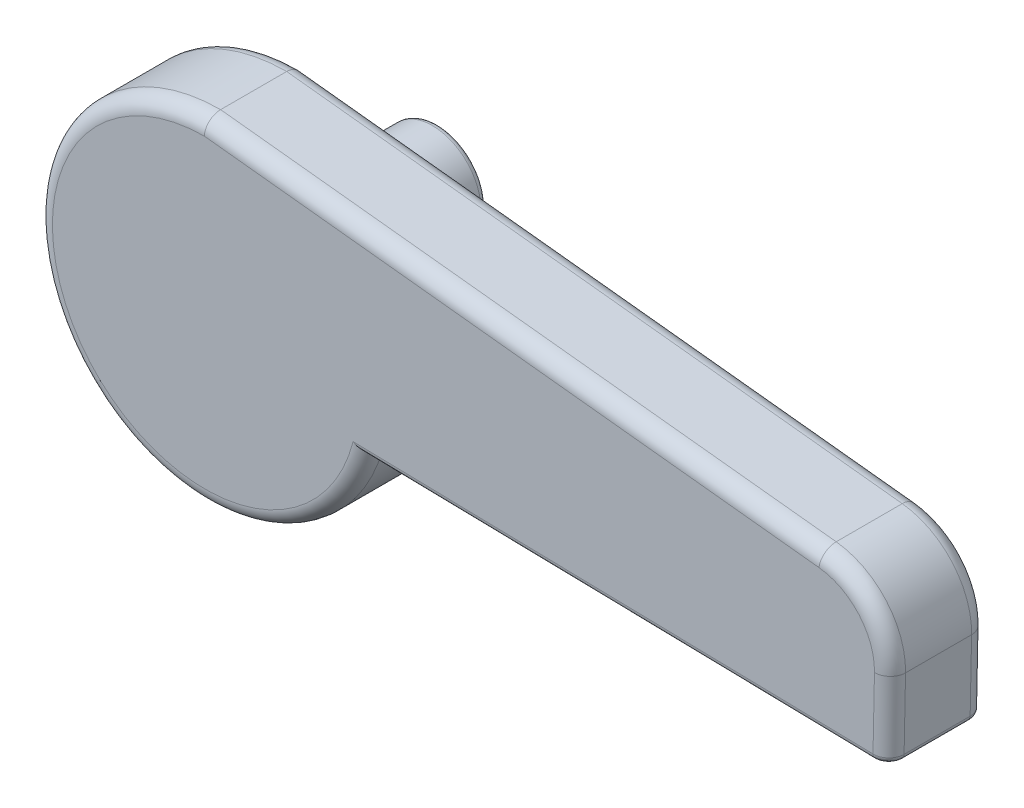
ISO-10303-21;
HEADER;
FILE_DESCRIPTION(('STEP AP214'),'2;1');
FILE_NAME('part.step','',(''),(''),'','','');
FILE_SCHEMA(('AUTOMOTIVE_DESIGN { 1 0 10303 214 1 1 1 1 }'));
ENDSEC;
DATA;
#1=APPLICATION_CONTEXT('core data for automotive mechanical design processes');
#2=APPLICATION_PROTOCOL_DEFINITION('international standard','automotive_design',2000,#1);
#3=PRODUCT_CONTEXT('',#1,'mechanical');
#4=PRODUCT('Part','Part','',(#3));
#5=PRODUCT_RELATED_PRODUCT_CATEGORY('part','',(#4));
#6=PRODUCT_DEFINITION_FORMATION('','',#4);
#7=PRODUCT_DEFINITION_CONTEXT('part definition',#1,'design');
#8=PRODUCT_DEFINITION('design','',#6,#7);
#9=PRODUCT_DEFINITION_SHAPE('','',#8);
#10=(LENGTH_UNIT() NAMED_UNIT(*) SI_UNIT(.MILLI.,.METRE.));
#11=(NAMED_UNIT(*) PLANE_ANGLE_UNIT() SI_UNIT($,.RADIAN.));
#12=(NAMED_UNIT(*) SI_UNIT($,.STERADIAN.) SOLID_ANGLE_UNIT());
#13=UNCERTAINTY_MEASURE_WITH_UNIT(LENGTH_MEASURE(1.E-05),#10,'distance_accuracy_value','');
#14=(GEOMETRIC_REPRESENTATION_CONTEXT(3) GLOBAL_UNCERTAINTY_ASSIGNED_CONTEXT((#13)) GLOBAL_UNIT_ASSIGNED_CONTEXT((#10,
#11,#12)) REPRESENTATION_CONTEXT('',''));
#15=CARTESIAN_POINT('',(0.,0.,0.));
#16=DIRECTION('',(0.,0.,1.));
#17=DIRECTION('',(1.,0.,0.));
#18=AXIS2_PLACEMENT_3D('',#15,#16,#17);
#19=CARTESIAN_POINT('',(48.1945710192057,-2.50000000000015,5.49999999999978));
#20=DIRECTION('',(0.,0.,-1.));
#21=DIRECTION('',(-1.,0.,0.));
#22=AXIS2_PLACEMENT_3D('',#19,#20,#21);
#23=CYLINDRICAL_SURFACE('',#22,2.5);
#24=CARTESIAN_POINT('',(48.1945710192057,-2.50000000000015,-4.20000000000022));
#25=DIRECTION('',(0.,0.,1.));
#26=DIRECTION('',(1.,0.,0.));
#27=AXIS2_PLACEMENT_3D('',#24,#25,#26);
#28=CIRCLE('',#27,2.5);
#29=CARTESIAN_POINT('',(50.6945710192057,-2.50000000000015,-4.20000000000022));
#30=VERTEX_POINT('',#29);
#31=EDGE_CURVE('E380',#30,#30,#28,.T.);
#32=ORIENTED_EDGE('',*,*,#31,.T.);
#33=EDGE_LOOP('',(#32));
#34=FACE_BOUND('',#33,.T.);
#35=CARTESIAN_POINT('',(48.1945710192057,-2.50000000000015,1.49999999999978));
#36=DIRECTION('',(0.,0.,1.));
#37=DIRECTION('',(1.,0.,0.));
#38=AXIS2_PLACEMENT_3D('',#35,#36,#37);
#39=CIRCLE('',#38,2.5);
#40=CARTESIAN_POINT('',(50.6945710192057,-2.50000000000015,1.49999999999978));
#41=VERTEX_POINT('',#40);
#42=EDGE_CURVE('E382',#41,#41,#39,.F.);
#43=ORIENTED_EDGE('',*,*,#42,.T.);
#44=EDGE_LOOP('',(#43));
#45=FACE_BOUND('',#44,.T.);
#46=ADVANCED_FACE('F41',(#34,#45),#23,.T.);
#47=CARTESIAN_POINT('',(48.1945710192057,-2.50000000000015,-4.50000000000022));
#48=DIRECTION('',(0.,0.,1.));
#49=DIRECTION('',(1.,0.,0.));
#50=AXIS2_PLACEMENT_3D('',#47,#48,#49);
#51=PLANE('',#50);
#52=CARTESIAN_POINT('',(48.1945710192057,-2.50000000000015,-4.50000000000022));
#53=DIRECTION('',(0.,0.,1.));
#54=DIRECTION('',(1.,0.,0.));
#55=AXIS2_PLACEMENT_3D('',#52,#53,#54);
#56=CIRCLE('',#55,2.2);
#57=CARTESIAN_POINT('',(50.3945710192057,-2.50000000000015,-4.50000000000022));
#58=VERTEX_POINT('',#57);
#59=EDGE_CURVE('E149',#58,#58,#56,.F.);
#60=ORIENTED_EDGE('',*,*,#59,.T.);
#61=EDGE_LOOP('',(#60));
#62=FACE_BOUND('',#61,.T.);
#63=ADVANCED_FACE('F205',(#62),#51,.F.);
#64=CARTESIAN_POINT('',(-0.073121969890185,-3.59102972612676,7.49999999999978));
#65=DIRECTION('',(-0.0203581760665292,-0.999792750857519,0.));
#66=DIRECTION('',(0.999792750857519,-0.0203581760665292,0.));
#67=AXIS2_PLACEMENT_3D('',#64,#65,#66);
#68=PLANE('',#67);
#69=CARTESIAN_POINT('',(77.1202218189666,-5.16287117293639,5.00064844914062));
#70=DIRECTION('',(-0.0203581760665292,-0.999792750857519,0.));
#71=DIRECTION('',(0.999792750857519,-0.0203581760665292,0.));
#72=AXIS2_PLACEMENT_3D('',#69,#70,#71);
#73=CIRCLE('',#72,1.74999999999999);
#74=CARTESIAN_POINT('',(78.8698591329672,-5.19849798105282,5.00064844914062));
#75=VERTEX_POINT('',#74);
#76=EDGE_CURVE('E393',#75,#75,#73,.T.);
#77=ORIENTED_EDGE('',*,*,#76,.F.);
#78=EDGE_LOOP('',(#77));
#79=FACE_BOUND('',#78,.T.);
#80=CARTESIAN_POINT('',(62.1233316379012,-4.85749855396644,5.00634587382254));
#81=DIRECTION('',(-0.0203581760665292,-0.999792750857519,0.));
#82=DIRECTION('',(0.999792750857519,-0.0203581760665292,0.));
#83=AXIS2_PLACEMENT_3D('',#80,#81,#82);
#84=CIRCLE('',#83,1.74999999999999);
#85=CARTESIAN_POINT('',(63.8729689519018,-4.89312536208287,5.00634587382254));
#86=VERTEX_POINT('',#85);
#87=EDGE_CURVE('E390',#86,#86,#84,.T.);
#88=ORIENTED_EDGE('',*,*,#87,.F.);
#89=EDGE_LOOP('',(#88));
#90=FACE_BOUND('',#89,.T.);
#91=CARTESIAN_POINT('',(82.5687320547102,-5.27381589681483,6.69999999999978));
#92=DIRECTION('',(-0.0203581760665292,-0.999792750857519,0.));
#93=DIRECTION('',(0.999792750857519,-0.0203581760665292,0.));
#94=AXIS2_PLACEMENT_3D('',#91,#92,#93);
#95=CIRCLE('',#94,0.5);
#96=CARTESIAN_POINT('',(83.068628430139,-5.2839949848481,6.69999999999978));
#97=VERTEX_POINT('',#96);
#98=CARTESIAN_POINT('',(82.5687320547102,-5.27381589681483,7.19999999999978));
#99=VERTEX_POINT('',#98);
#100=EDGE_CURVE('E348',#97,#99,#95,.T.);
#101=ORIENTED_EDGE('',*,*,#100,.T.);
#102=DIRECTION('',(-0.999792750857519,0.0203581760665292,0.));
#103=VECTOR('',#102,1.);
#104=CARTESIAN_POINT('',(-0.073121969890185,-3.59102972612676,7.19999999999978));
#105=LINE('',#104,#103);
#106=CARTESIAN_POINT('',(56.3767467829092,-4.74048431660691,7.19999999999979));
#107=VERTEX_POINT('',#106);
#108=EDGE_CURVE('E350',#99,#107,#105,.T.);
#109=ORIENTED_EDGE('',*,*,#108,.T.);
#110=CARTESIAN_POINT('',(55.7312139879501,-4.72733972210448,7.49999999999978));
#111=CARTESIAN_POINT('',(55.7789212996699,-4.72831115728524,7.50003397064687));
#112=CARTESIAN_POINT('',(55.8266315718824,-4.72928265274872,7.49602955410145));
#113=CARTESIAN_POINT('',(55.9207422157983,-4.73119897096261,7.48014592752088));
#114=CARTESIAN_POINT('',(55.967142061802,-4.73214378300849,7.46826360263125));
#115=CARTESIAN_POINT('',(56.0573204224829,-4.73398003051335,7.43681100258886));
#116=CARTESIAN_POINT('',(56.1010963185076,-4.73487141265027,7.41723319000377));
#117=CARTESIAN_POINT('',(56.1846284621169,-4.73657232725018,7.37086998223443));
#118=CARTESIAN_POINT('',(56.2243868812021,-4.73738190393011,7.34408850970474));
#119=CARTESIAN_POINT('',(56.2979017520504,-4.73887884285366,7.28459841150574));
#120=CARTESIAN_POINT('',(56.3317611647186,-4.73956830162801,7.25201718374874));
#121=CARTESIAN_POINT('',(56.3933221880693,-4.74082183157322,7.18145649790667));
#122=CARTESIAN_POINT('',(56.4210229828188,-4.74138588612974,7.14347632562639));
#123=CARTESIAN_POINT('',(56.468548959889,-4.74235362890253,7.06449131041161));
#124=CARTESIAN_POINT('',(56.4885933147328,-4.74276177999654,7.02361817616138));
#125=CARTESIAN_POINT('',(56.5213149064872,-4.74342807001069,6.93904121656419));
#126=CARTESIAN_POINT('',(56.5339997550354,-4.743686363922,6.89534036800726));
#127=CARTESIAN_POINT('',(56.5477104187668,-4.74396554588846,6.82605275719267));
#128=CARTESIAN_POINT('',(56.5514106755768,-4.7440408919835,6.80096682670318));
#129=CARTESIAN_POINT('',(56.5563454941828,-4.74414137671491,6.7505913979176));
#130=CARTESIAN_POINT('',(56.5575837291154,-4.74416659014515,6.72530225947758));
#131=CARTESIAN_POINT('',(56.5575822859618,-4.74416656075908,6.69999999999975));
#132=B_SPLINE_CURVE_WITH_KNOTS('',3,(#110,#111,#112,#113,#114,#115,#116,#117,#118,#119,#120,
#121,#122,#123,#124,#125,#126,#127,#128,#129,#130,#131),.UNSPECIFIED.,.F.,.F.,(4,2,2,2,2,2,2,2,
2,2,4),(0.,0.142990058816161,0.286036688366128,0.429223777081963,0.572333052522775,
0.712618169705682,0.852921861696044,0.988838524067434,1.12461436162129,1.20057852384013,
1.27642926840867),.UNSPECIFIED.);
#133=CARTESIAN_POINT('',(56.5575822859622,-4.74416656075865,6.69999999999978));
#134=VERTEX_POINT('',#133);
#135=EDGE_CURVE('E211',#107,#134,#132,.T.);
#136=ORIENTED_EDGE('',*,*,#135,.T.);
#137=DIRECTION('',(0.,0.,-1.));
#138=VECTOR('',#137,1.);
#139=CARTESIAN_POINT('',(56.5575822859622,-4.74416656075865,7.49999999999978));
#140=LINE('',#139,#138);
#141=CARTESIAN_POINT('',(56.5575822859622,-4.74416656075865,3.29999999999978));
#142=VERTEX_POINT('',#141);
#143=EDGE_CURVE('E367',#134,#142,#140,.T.);
#144=ORIENTED_EDGE('',*,*,#143,.T.);
#145=CARTESIAN_POINT('',(56.5575822859619,-4.74416656075858,3.29999999999978));
#146=CARTESIAN_POINT('',(56.557625403597,-4.74416743873727,3.25596612702113));
#147=CARTESIAN_POINT('',(56.5538413345335,-4.74409038602405,3.21195070675883));
#148=CARTESIAN_POINT('',(56.5389453240458,-4.74378706755746,3.12524602035933));
#149=CARTESIAN_POINT('',(56.5278447936871,-4.74356103416072,3.08255479733669));
#150=CARTESIAN_POINT('',(56.4986373213318,-4.74296630003789,2.99963404953817));
#151=CARTESIAN_POINT('',(56.4805288448736,-4.74259756806648,2.95940506613069));
#152=CARTESIAN_POINT('',(56.4378963109812,-4.74172946752225,2.88251062235352));
#153=CARTESIAN_POINT('',(56.4133720109644,-4.74123009400987,2.84584529679786));
#154=CARTESIAN_POINT('',(56.3583318718413,-4.74010934489258,2.77662312331813));
#155=CARTESIAN_POINT('',(56.3277488506898,-4.73948660130025,2.74411976576125));
#156=CARTESIAN_POINT('',(56.261689139985,-4.73814146730095,2.68453792132652));
#157=CARTESIAN_POINT('',(56.2262114046873,-4.73741905560011,2.65746059674825));
#158=CARTESIAN_POINT('',(56.1503269541931,-4.7358738663571,2.60869087207023));
#159=CARTESIAN_POINT('',(56.1098103891408,-4.73504885200864,2.5871696660029));
#160=CARTESIAN_POINT('',(56.0258165833358,-4.73333853686021,2.55100903137019));
#161=CARTESIAN_POINT('',(55.9823395835137,-4.73245324096617,2.53636904355146));
#162=CARTESIAN_POINT('',(55.9041828743235,-4.73086178309142,2.5168968214449));
#163=CARTESIAN_POINT('',(55.8698685718053,-4.73016306166974,2.51056045845017));
#164=CARTESIAN_POINT('',(55.8007767427003,-4.72875618647438,2.50211205399567));
#165=CARTESIAN_POINT('',(55.7660000001124,-4.7280480486648,2.49999360162255));
#166=CARTESIAN_POINT('',(55.7312139879501,-4.72733972210448,2.49999999999978));
#167=B_SPLINE_CURVE_WITH_KNOTS('',3,(#145,#146,#147,#148,#149,#150,#151,#152,#153,#154,#155,
#156,#157,#158,#159,#160,#161,#162,#163,#164,#165,#166),.UNSPECIFIED.,.F.,.F.,(4,2,2,2,2,2,2,2,
2,2,4),(0.,0.131911471334583,0.263617693194719,0.395352769813457,0.527092828063998,
0.660384903747363,0.793705501208028,0.93074337248579,1.06777010443553,1.17222539503518,
1.27652179972071),.UNSPECIFIED.);
#168=CARTESIAN_POINT('',(56.3767467829093,-4.74048431660692,2.79999999999994));
#169=VERTEX_POINT('',#168);
#170=EDGE_CURVE('E186',#142,#169,#167,.T.);
#171=ORIENTED_EDGE('',*,*,#170,.T.);
#172=DIRECTION('',(-0.999792750857519,0.0203581760665292,0.));
#173=VECTOR('',#172,1.);
#174=CARTESIAN_POINT('',(82.5687320547103,-5.27381589681484,2.79999999999978));
#175=LINE('',#174,#173);
#176=CARTESIAN_POINT('',(82.5687320547102,-5.27381589681483,2.79999999999978));
#177=VERTEX_POINT('',#176);
#178=EDGE_CURVE('E219',#169,#177,#175,.F.);
#179=ORIENTED_EDGE('',*,*,#178,.T.);
#180=CARTESIAN_POINT('',(82.5687320547102,-5.27381589681483,3.29999999999978));
#181=DIRECTION('',(-0.0203581760665292,-0.999792750857519,0.));
#182=DIRECTION('',(0.999792750857519,-0.0203581760665292,0.));
#183=AXIS2_PLACEMENT_3D('',#180,#181,#182);
#184=CIRCLE('',#183,0.5);
#185=CARTESIAN_POINT('',(83.068628430139,-5.2839949848481,3.29999999999978));
#186=VERTEX_POINT('',#185);
#187=EDGE_CURVE('E344',#177,#186,#184,.T.);
#188=ORIENTED_EDGE('',*,*,#187,.T.);
#189=DIRECTION('',(0.,0.,-1.));
#190=VECTOR('',#189,1.);
#191=CARTESIAN_POINT('',(83.068628430139,-5.2839949848481,6.69999999999978));
#192=LINE('',#191,#190);
#193=EDGE_CURVE('E346',#186,#97,#192,.F.);
#194=ORIENTED_EDGE('',*,*,#193,.T.);
#195=EDGE_LOOP('',(#101,#109,#136,#144,#171,#179,#188,#194));
#196=FACE_BOUND('',#195,.T.);
#197=ADVANCED_FACE('F200',(#79,#90,#196),#68,.T.);
#198=CARTESIAN_POINT('',(83.4416882252864,-1.69907271154164,7.49999999999978));
#199=DIRECTION('',(-0.999792750857519,0.0203581760665333,0.));
#200=DIRECTION('',(-0.0203581760665333,-0.999792750857519,0.));
#201=AXIS2_PLACEMENT_3D('',#198,#199,#200);
#202=PLANE('',#201);
#203=DIRECTION('',(0.0203581760665333,0.999792750857519,0.));
#204=VECTOR('',#203,1.);
#205=CARTESIAN_POINT('',(83.3685662553962,-5.29010243766718,6.69999999999978));
#206=LINE('',#205,#204);
#207=CARTESIAN_POINT('',(83.449411075558,-1.31980250127088,6.69999999999978));
#208=VERTEX_POINT('',#207);
#209=CARTESIAN_POINT('',(83.3746737082162,-4.9901646124108,6.69999999999978));
#210=VERTEX_POINT('',#209);
#211=EDGE_CURVE('E323',#208,#210,#206,.F.);
#212=ORIENTED_EDGE('',*,*,#211,.T.);
#213=DIRECTION('',(0.,0.,-1.));
#214=VECTOR('',#213,1.);
#215=CARTESIAN_POINT('',(83.3746737082162,-4.9901646124108,3.29999999999978));
#216=LINE('',#215,#214);
#217=CARTESIAN_POINT('',(83.3746737082162,-4.9901646124108,3.29999999999978));
#218=VERTEX_POINT('',#217);
#219=EDGE_CURVE('E146',#210,#218,#216,.T.);
#220=ORIENTED_EDGE('',*,*,#219,.T.);
#221=DIRECTION('',(0.0203581760665333,0.999792750857519,0.));
#222=VECTOR('',#221,1.);
#223=CARTESIAN_POINT('',(83.4416882252864,-1.69907271154164,3.29999999999978));
#224=LINE('',#223,#222);
#225=CARTESIAN_POINT('',(83.449411075558,-1.31980250127088,3.29999999999978));
#226=VERTEX_POINT('',#225);
#227=EDGE_CURVE('E139',#218,#226,#224,.T.);
#228=ORIENTED_EDGE('',*,*,#227,.T.);
#229=DIRECTION('',(0.,0.,-1.));
#230=VECTOR('',#229,1.);
#231=CARTESIAN_POINT('',(83.449411075558,-1.31980250127088,7.49999999999978));
#232=LINE('',#231,#230);
#233=EDGE_CURVE('E143',#208,#226,#232,.T.);
#234=ORIENTED_EDGE('',*,*,#233,.F.);
#235=EDGE_LOOP('',(#212,#220,#228,#234));
#236=FACE_BOUND('',#235,.T.);
#237=ADVANCED_FACE('F142',(#236),#202,.F.);
#238=CARTESIAN_POINT('',(79.4502400721279,-1.23836979700526,7.49999999999978));
#239=DIRECTION('',(0.,0.,-1.));
#240=DIRECTION('',(-1.,0.,0.));
#241=AXIS2_PLACEMENT_3D('',#238,#239,#240);
#242=CYLINDRICAL_SURFACE('',#241,4.00000000000026);
#243=DIRECTION('',(0.,0.,-1.));
#244=VECTOR('',#243,1.);
#245=CARTESIAN_POINT('',(79.8795414104662,2.73852602271456,7.49999999999978));
#246=LINE('',#245,#244);
#247=CARTESIAN_POINT('',(79.8795414104662,2.73852602271456,6.69999999999978));
#248=VERTEX_POINT('',#247);
#249=CARTESIAN_POINT('',(79.8795414104662,2.73852602271456,3.29999999999978));
#250=VERTEX_POINT('',#249);
#251=EDGE_CURVE('E161',#248,#250,#246,.T.);
#252=ORIENTED_EDGE('',*,*,#251,.F.);
#253=CARTESIAN_POINT('',(79.4502400721279,-1.23836979700526,6.69999999999978));
#254=DIRECTION('',(0.,0.,1.));
#255=DIRECTION('',(1.,0.,0.));
#256=AXIS2_PLACEMENT_3D('',#253,#254,#255);
#257=CIRCLE('',#256,4.00000000000026);
#258=EDGE_CURVE('E159',#248,#208,#257,.F.);
#259=ORIENTED_EDGE('',*,*,#258,.T.);
#260=ORIENTED_EDGE('',*,*,#233,.T.);
#261=CARTESIAN_POINT('',(79.4502400721279,-1.23836979700526,3.29999999999978));
#262=DIRECTION('',(0.,0.,1.));
#263=DIRECTION('',(1.,0.,0.));
#264=AXIS2_PLACEMENT_3D('',#261,#262,#263);
#265=CIRCLE('',#264,4.00000000000026);
#266=EDGE_CURVE('E156',#226,#250,#265,.T.);
#267=ORIENTED_EDGE('',*,*,#266,.T.);
#268=EDGE_LOOP('',(#252,#259,#260,#267));
#269=FACE_BOUND('',#268,.T.);
#270=ADVANCED_FACE('F154',(#269),#242,.T.);
#271=CARTESIAN_POINT('',(1.21232623147537,11.2305615928261,7.49999999999978));
#272=DIRECTION('',(-0.107325334584564,-0.99422395492983,0.));
#273=DIRECTION('',(0.994223954929829,-0.107325334584564,0.));
#274=AXIS2_PLACEMENT_3D('',#271,#272,#273);
#275=PLANE('',#274);
#276=DIRECTION('',(0.,0.,-1.));
#277=VECTOR('',#276,1.);
#278=CARTESIAN_POINT('',(48.1945710192066,6.1588822027102,7.49999999999978));
#279=LINE('',#278,#277);
#280=CARTESIAN_POINT('',(48.1945710192066,6.1588822027102,6.69999999999978));
#281=VERTEX_POINT('',#280);
#282=CARTESIAN_POINT('',(48.1945710192066,6.1588822027102,3.29999999999978));
#283=VERTEX_POINT('',#282);
#284=EDGE_CURVE('E328',#281,#283,#279,.T.);
#285=ORIENTED_EDGE('',*,*,#284,.F.);
#286=DIRECTION('',(-0.994223954929829,0.107325334584564,0.));
#287=VECTOR('',#286,1.);
#288=CARTESIAN_POINT('',(79.8795414104662,2.73852602271456,6.69999999999978));
#289=LINE('',#288,#287);
#290=EDGE_CURVE('E220',#281,#248,#289,.F.);
#291=ORIENTED_EDGE('',*,*,#290,.T.);
#292=ORIENTED_EDGE('',*,*,#251,.T.);
#293=DIRECTION('',(-0.994223954929829,0.107325334584564,0.));
#294=VECTOR('',#293,1.);
#295=CARTESIAN_POINT('',(1.21232623147537,11.2305615928261,3.29999999999978));
#296=LINE('',#295,#294);
#297=EDGE_CURVE('E178',#250,#283,#296,.T.);
#298=ORIENTED_EDGE('',*,*,#297,.T.);
#299=EDGE_LOOP('',(#285,#291,#292,#298));
#300=FACE_BOUND('',#299,.T.);
#301=ADVANCED_FACE('F327',(#300),#275,.F.);
#302=CARTESIAN_POINT('',(48.1945710192067,-2.49999999999489,7.49999999999978));
#303=DIRECTION('',(0.,0.,-1.));
#304=DIRECTION('',(-1.,0.,0.));
#305=AXIS2_PLACEMENT_3D('',#302,#303,#304);
#306=CYLINDRICAL_SURFACE('',#305,8.6588822027052);
#307=ORIENTED_EDGE('',*,*,#143,.F.);
#308=CARTESIAN_POINT('',(48.1945710192067,-2.49999999999489,6.69999999999978));
#309=DIRECTION('',(0.,0.,1.));
#310=DIRECTION('',(1.,0.,0.));
#311=AXIS2_PLACEMENT_3D('',#308,#309,#310);
#312=CIRCLE('',#311,8.6588822027052);
#313=EDGE_CURVE('E321',#134,#281,#312,.F.);
#314=ORIENTED_EDGE('',*,*,#313,.T.);
#315=ORIENTED_EDGE('',*,*,#284,.T.);
#316=CARTESIAN_POINT('',(48.1945710192067,-2.49999999999489,3.29999999999978));
#317=DIRECTION('',(0.,0.,1.));
#318=DIRECTION('',(1.,0.,0.));
#319=AXIS2_PLACEMENT_3D('',#316,#317,#318);
#320=CIRCLE('',#319,8.6588822027052);
#321=EDGE_CURVE('E175',#283,#142,#320,.T.);
#322=ORIENTED_EDGE('',*,*,#321,.T.);
#323=EDGE_LOOP('',(#307,#314,#315,#322));
#324=FACE_BOUND('',#323,.T.);
#325=ADVANCED_FACE('F373',(#324),#306,.T.);
#326=CARTESIAN_POINT('',(0.,0.,7.49999999999978));
#327=DIRECTION('',(0.,0.,1.));
#328=DIRECTION('',(1.,0.,0.));
#329=AXIS2_PLACEMENT_3D('',#326,#327,#328);
#330=PLANE('',#329);
#331=CARTESIAN_POINT('',(48.1945710192067,-2.49999999999489,7.49999999999978));
#332=DIRECTION('',(0.,0.,1.));
#333=DIRECTION('',(1.,0.,0.));
#334=AXIS2_PLACEMENT_3D('',#331,#332,#333);
#335=CIRCLE('',#334,7.8588822027052);
#336=CARTESIAN_POINT('',(48.1525569056241,5.35876989676738,7.49999999999978));
#337=VERTEX_POINT('',#336);
#338=CARTESIAN_POINT('',(55.8130488822072,-4.42894388900962,7.49999999999978));
#339=VERTEX_POINT('',#338);
#340=EDGE_CURVE('E319',#337,#339,#335,.T.);
#341=ORIENTED_EDGE('',*,*,#340,.T.);
#342=DIRECTION('',(-0.999792750857519,0.0203581760665292,0.));
#343=VECTOR('',#342,1.);
#344=CARTESIAN_POINT('',(-0.0670145170702262,-3.2910919008695,7.49999999999978));
#345=LINE('',#344,#343);
#346=CARTESIAN_POINT('',(82.5748395075302,-4.97387807155758,7.49999999999978));
#347=VERTEX_POINT('',#346);
#348=EDGE_CURVE('E353',#339,#347,#345,.F.);
#349=ORIENTED_EDGE('',*,*,#348,.T.);
#350=DIRECTION('',(0.0203581760665333,0.999792750857519,0.));
#351=VECTOR('',#350,1.);
#352=CARTESIAN_POINT('',(82.649576874872,-1.30351596041765,7.49999999999978));
#353=LINE('',#352,#351);
#354=CARTESIAN_POINT('',(82.6495768748722,-1.30351596041765,7.49999999999978));
#355=VERTEX_POINT('',#354);
#356=EDGE_CURVE('E317',#347,#355,#353,.T.);
#357=ORIENTED_EDGE('',*,*,#356,.T.);
#358=CARTESIAN_POINT('',(79.4502400721279,-1.23836979700526,7.49999999999978));
#359=DIRECTION('',(0.,0.,1.));
#360=DIRECTION('',(1.,0.,0.));
#361=AXIS2_PLACEMENT_3D('',#358,#359,#360);
#362=CIRCLE('',#361,3.20000000000026);
#363=CARTESIAN_POINT('',(79.7936811427986,1.94314685877069,7.49999999999978));
#364=VERTEX_POINT('',#363);
#365=EDGE_CURVE('E315',#355,#364,#362,.T.);
#366=ORIENTED_EDGE('',*,*,#365,.T.);
#367=DIRECTION('',(-0.994223954929829,0.107325334584564,0.));
#368=VECTOR('',#367,1.);
#369=CARTESIAN_POINT('',(48.1087107515389,5.36350303876633,7.49999999999978));
#370=LINE('',#369,#368);
#371=EDGE_CURVE('E194',#364,#337,#370,.T.);
#372=ORIENTED_EDGE('',*,*,#371,.T.);
#373=EDGE_LOOP('',(#341,#349,#357,#366,#372));
#374=FACE_BOUND('',#373,.T.);
#375=ADVANCED_FACE('F419',(#374),#330,.T.);
#376=CARTESIAN_POINT('',(0.,0.,2.49999999999978));
#377=DIRECTION('',(0.,0.,1.));
#378=DIRECTION('',(1.,0.,0.));
#379=AXIS2_PLACEMENT_3D('',#376,#377,#378);
#380=PLANE('',#379);
#381=CARTESIAN_POINT('',(48.1945710192057,-2.50000000000015,2.49999999999978));
#382=DIRECTION('',(0.,0.,1.));
#383=DIRECTION('',(1.,0.,0.));
#384=AXIS2_PLACEMENT_3D('',#381,#382,#383);
#385=CIRCLE('',#384,3.5);
#386=CARTESIAN_POINT('',(51.6945710192057,-2.50000000000015,2.49999999999978));
#387=VERTEX_POINT('',#386);
#388=EDGE_CURVE('E160',#387,#387,#385,.T.);
#389=ORIENTED_EDGE('',*,*,#388,.T.);
#390=EDGE_LOOP('',(#389));
#391=FACE_BOUND('',#390,.T.);
#392=DIRECTION('',(0.0203581760665333,0.999792750857519,0.));
#393=VECTOR('',#392,1.);
#394=CARTESIAN_POINT('',(82.6418540246004,-1.68278617068841,2.49999999999978));
#395=LINE('',#394,#393);
#396=CARTESIAN_POINT('',(82.6495768748722,-1.30351596041765,2.49999999999978));
#397=VERTEX_POINT('',#396);
#398=CARTESIAN_POINT('',(82.5748395075302,-4.97387807155758,2.49999999999978));
#399=VERTEX_POINT('',#398);
#400=EDGE_CURVE('E166',#397,#399,#395,.F.);
#401=ORIENTED_EDGE('',*,*,#400,.T.);
#402=DIRECTION('',(-0.999792750857519,0.0203581760665292,0.));
#403=VECTOR('',#402,1.);
#404=CARTESIAN_POINT('',(55.7373214407701,-4.42740189684722,2.49999999999978));
#405=LINE('',#404,#403);
#406=CARTESIAN_POINT('',(55.8130488822072,-4.42894388900962,2.49999999999978));
#407=VERTEX_POINT('',#406);
#408=EDGE_CURVE('E248',#399,#407,#405,.T.);
#409=ORIENTED_EDGE('',*,*,#408,.T.);
#410=CARTESIAN_POINT('',(48.1945710192067,-2.49999999999489,2.49999999999978));
#411=DIRECTION('',(0.,0.,1.));
#412=DIRECTION('',(1.,0.,0.));
#413=AXIS2_PLACEMENT_3D('',#410,#411,#412);
#414=CIRCLE('',#413,7.8588822027052);
#415=CARTESIAN_POINT('',(48.1525569056242,5.35876989676738,2.49999999999978));
#416=VERTEX_POINT('',#415);
#417=EDGE_CURVE('E58',#407,#416,#414,.F.);
#418=ORIENTED_EDGE('',*,*,#417,.T.);
#419=DIRECTION('',(-0.994223954929829,0.107325334584564,0.));
#420=VECTOR('',#419,1.);
#421=CARTESIAN_POINT('',(1.12646596380772,10.4351824288822,2.49999999999978));
#422=LINE('',#421,#420);
#423=CARTESIAN_POINT('',(79.7936811427986,1.94314685877069,2.49999999999978));
#424=VERTEX_POINT('',#423);
#425=EDGE_CURVE('E148',#416,#424,#422,.F.);
#426=ORIENTED_EDGE('',*,*,#425,.T.);
#427=CARTESIAN_POINT('',(79.4502400721279,-1.23836979700526,2.49999999999978));
#428=DIRECTION('',(0.,0.,1.));
#429=DIRECTION('',(1.,0.,0.));
#430=AXIS2_PLACEMENT_3D('',#427,#428,#429);
#431=CIRCLE('',#430,3.20000000000026);
#432=EDGE_CURVE('E180',#424,#397,#431,.F.);
#433=ORIENTED_EDGE('',*,*,#432,.T.);
#434=EDGE_LOOP('',(#401,#409,#418,#426,#433));
#435=FACE_BOUND('',#434,.T.);
#436=ADVANCED_FACE('F360',(#391,#435),#380,.F.);
#437=CARTESIAN_POINT('',(62.2251225182338,0.141465200321151,5.00634587382254));
#438=DIRECTION('',(-0.0203581760665292,-0.999792750857519,0.));
#439=DIRECTION('',(0.999792750857519,-0.0203581760665292,0.));
#440=AXIS2_PLACEMENT_3D('',#437,#438,#439);
#441=CYLINDRICAL_SURFACE('',#440,1.74999999999999);
#442=CARTESIAN_POINT('',(62.2251225182338,0.141465200321151,5.00634587382254));
#443=DIRECTION('',(-0.0203581760665292,-0.999792750857519,0.));
#444=DIRECTION('',(0.999792750857519,-0.0203581760665292,0.));
#445=AXIS2_PLACEMENT_3D('',#442,#443,#444);
#446=CIRCLE('',#445,1.74999999999999);
#447=CARTESIAN_POINT('',(63.9747598322344,0.105838392204725,5.00634587382254));
#448=VERTEX_POINT('',#447);
#449=EDGE_CURVE('E313',#448,#448,#446,.T.);
#450=ORIENTED_EDGE('',*,*,#449,.F.);
#451=EDGE_LOOP('',(#450));
#452=FACE_BOUND('',#451,.T.);
#453=ORIENTED_EDGE('',*,*,#87,.T.);
#454=EDGE_LOOP('',(#453));
#455=FACE_BOUND('',#454,.T.);
#456=ADVANCED_FACE('F409',(#452,#455),#441,.F.);
#457=CARTESIAN_POINT('',(62.2251225182338,0.141465200321151,5.00634587382254));
#458=DIRECTION('',(-0.0203581760665292,-0.999792750857519,0.));
#459=DIRECTION('',(0.999792750857519,-0.0203581760665292,0.));
#460=AXIS2_PLACEMENT_3D('',#457,#458,#459);
#461=PLANE('',#460);
#462=ORIENTED_EDGE('',*,*,#449,.T.);
#463=EDGE_LOOP('',(#462));
#464=FACE_BOUND('',#463,.T.);
#465=ADVANCED_FACE('F403',(#464),#461,.T.);
#466=CARTESIAN_POINT('',(77.2220126992992,-0.1639074186488,5.00064844914062));
#467=DIRECTION('',(-0.0203581760665292,-0.999792750857519,0.));
#468=DIRECTION('',(0.999792750857519,-0.0203581760665292,0.));
#469=AXIS2_PLACEMENT_3D('',#466,#467,#468);
#470=CYLINDRICAL_SURFACE('',#469,1.74999999999999);
#471=CARTESIAN_POINT('',(77.2220126992992,-0.1639074186488,5.00064844914062));
#472=DIRECTION('',(-0.0203581760665292,-0.999792750857519,0.));
#473=DIRECTION('',(0.999792750857519,-0.0203581760665292,0.));
#474=AXIS2_PLACEMENT_3D('',#471,#472,#473);
#475=CIRCLE('',#474,1.74999999999999);
#476=CARTESIAN_POINT('',(78.9716500132998,-0.199534226765226,5.00064844914062));
#477=VERTEX_POINT('',#476);
#478=EDGE_CURVE('E371',#477,#477,#475,.T.);
#479=ORIENTED_EDGE('',*,*,#478,.F.);
#480=EDGE_LOOP('',(#479));
#481=FACE_BOUND('',#480,.T.);
#482=ORIENTED_EDGE('',*,*,#76,.T.);
#483=EDGE_LOOP('',(#482));
#484=FACE_BOUND('',#483,.T.);
#485=ADVANCED_FACE('F400',(#481,#484),#470,.F.);
#486=CARTESIAN_POINT('',(77.2220126992992,-0.1639074186488,5.00064844914062));
#487=DIRECTION('',(-0.0203581760665292,-0.999792750857519,0.));
#488=DIRECTION('',(0.999792750857519,-0.0203581760665292,0.));
#489=AXIS2_PLACEMENT_3D('',#486,#487,#488);
#490=PLANE('',#489);
#491=ORIENTED_EDGE('',*,*,#478,.T.);
#492=EDGE_LOOP('',(#491));
#493=FACE_BOUND('',#492,.T.);
#494=ADVANCED_FACE('F289',(#493),#490,.T.);
#495=CARTESIAN_POINT('',(48.1945710192057,-2.50000000000015,1.49999999999978));
#496=DIRECTION('',(0.,0.,1.));
#497=DIRECTION('',(1.,0.,0.));
#498=AXIS2_PLACEMENT_3D('',#495,#496,#497);
#499=TOROIDAL_SURFACE('',#498,3.5,1.);
#500=ORIENTED_EDGE('',*,*,#42,.F.);
#501=EDGE_LOOP('',(#500));
#502=FACE_BOUND('',#501,.T.);
#503=ORIENTED_EDGE('',*,*,#388,.F.);
#504=EDGE_LOOP('',(#503));
#505=FACE_BOUND('',#504,.T.);
#506=ADVANCED_FACE('F285',(#502,#505),#499,.F.);
#507=CARTESIAN_POINT('',(48.1945710192057,-2.50000000000015,-4.20000000000022));
#508=DIRECTION('',(0.,0.,1.));
#509=DIRECTION('',(1.,0.,0.));
#510=AXIS2_PLACEMENT_3D('',#507,#508,#509);
#511=TOROIDAL_SURFACE('',#510,2.2,0.3);
#512=ORIENTED_EDGE('',*,*,#59,.F.);
#513=EDGE_LOOP('',(#512));
#514=FACE_BOUND('',#513,.T.);
#515=ORIENTED_EDGE('',*,*,#31,.F.);
#516=EDGE_LOOP('',(#515));
#517=FACE_BOUND('',#516,.T.);
#518=ADVANCED_FACE('F288',(#514,#517),#511,.T.);
#519=CARTESIAN_POINT('',(48.1945710192067,-2.49999999999489,3.29999999999978));
#520=DIRECTION('',(0.,0.,1.));
#521=DIRECTION('',(1.,0.,0.));
#522=AXIS2_PLACEMENT_3D('',#519,#520,#521);
#523=TOROIDAL_SURFACE('',#522,7.8588822027052,0.8);
#524=ORIENTED_EDGE('',*,*,#170,.F.);
#525=ORIENTED_EDGE('',*,*,#321,.F.);
#526=CARTESIAN_POINT('',(48.1945710192066,6.1588822027102,3.29999999999978));
#527=CARTESIAN_POINT('',(48.1945733577267,6.15892061979543,3.25504270553084));
#528=CARTESIAN_POINT('',(48.1943671957892,6.15509484328194,3.21009719294207));
#529=CARTESIAN_POINT('',(48.1935551179229,6.13999827977133,3.12151128831115));
#530=CARTESIAN_POINT('',(48.1929495041488,6.1287331200864,3.0778699358342));
#531=CARTESIAN_POINT('',(48.1913553515679,6.09903348687621,2.99308251901244));
#532=CARTESIAN_POINT('',(48.1903666350484,6.08059568610748,2.95193762297775));
#533=CARTESIAN_POINT('',(48.1880391700473,6.03709467161653,2.87333797317759));
#534=CARTESIAN_POINT('',(48.1867005017799,6.01203297617449,2.83588237647535));
#535=CARTESIAN_POINT('',(48.1837147296488,5.95597744493885,2.76568932800925));
#536=CARTESIAN_POINT('',(48.1820674517084,5.92498026090996,2.73295455764414));
#537=CARTESIAN_POINT('',(48.1785162455619,5.85793177449991,2.67314060359073));
#538=CARTESIAN_POINT('',(48.1766122267064,5.82187868681277,2.64606342611902));
#539=CARTESIAN_POINT('',(48.1726040828869,5.74569245784046,2.59830139126807));
#540=CARTESIAN_POINT('',(48.1704996275577,5.70555257279528,2.57762733471375));
#541=CARTESIAN_POINT('',(48.1661583783697,5.62239656150502,2.54332849531145));
#542=CARTESIAN_POINT('',(48.1639217107311,5.57938317357907,2.52969710634993));
#543=CARTESIAN_POINT('',(48.16029409103,5.50930391607599,2.5138199718321));
#544=CARTESIAN_POINT('',(48.1589231264394,5.48274914225664,2.50920078668682));
#545=CARTESIAN_POINT('',(48.1561731090291,5.42933488807098,2.50266417381148));
#546=CARTESIAN_POINT('',(48.1547940709624,5.40247590986942,2.50074280651659));
#547=CARTESIAN_POINT('',(48.1531309505749,5.36999206268408,2.50005888004036));
#548=CARTESIAN_POINT('',(48.1528438212411,5.3643805681891,2.49999984205166));
#549=CARTESIAN_POINT('',(48.1525569056244,5.35876989676734,2.49999999999978));
#550=B_SPLINE_CURVE_WITH_KNOTS('',3,(#526,#527,#528,#529,#530,#531,#532,#533,#534,#535,#536,
#537,#538,#539,#540,#541,#542,#543,#544,#545,#546,#547,#548,#549),.UNSPECIFIED.,.F.,.F.,(4,2,2,
2,2,2,2,2,2,2,2,4),(0.,0.13469197580734,0.269282184178606,0.403934900823328,0.538556780093679,
0.673254825077947,0.808000554041232,0.942972350403045,1.07781731055316,1.15866620197064,
1.23939690828622,1.256252909971),.UNSPECIFIED.);
#551=EDGE_CURVE('E307',#416,#283,#550,.F.);
#552=ORIENTED_EDGE('',*,*,#551,.F.);
#553=ORIENTED_EDGE('',*,*,#417,.F.);
#554=CARTESIAN_POINT('',(56.3767467829093,-4.74048431660692,2.79999999999978));
#555=CARTESIAN_POINT('',(56.3605222571945,-4.74014745545801,2.78031132195841));
#556=CARTESIAN_POINT('',(56.3437092518777,-4.73787846298434,2.76124965888219));
#557=CARTESIAN_POINT('',(56.3092081968702,-4.73013004485303,2.7248518842758));
#558=CARTESIAN_POINT('',(56.2915264465365,-4.72467128983971,2.70750549583575));
#559=CARTESIAN_POINT('',(56.2473593990454,-4.70818373931888,2.66748330661264));
#560=CARTESIAN_POINT('',(56.220448110691,-4.69575827082037,2.64585656956864));
#561=CARTESIAN_POINT('',(56.1654056088779,-4.66706487789694,2.60697861964786));
#562=CARTESIAN_POINT('',(56.1372694507066,-4.65077991402408,2.58974753458599));
#563=CARTESIAN_POINT('',(56.0722174809283,-4.61068722947872,2.55563736937853));
#564=CARTESIAN_POINT('',(56.0350520997078,-4.58605053398995,2.54021186173085));
#565=CARTESIAN_POINT('',(55.9600965500793,-4.53454320903393,2.51673709099889));
#566=CARTESIAN_POINT('',(55.9223074939448,-4.50767627121005,2.50867589350744));
#567=CARTESIAN_POINT('',(55.8622025036868,-4.46448105446701,2.50157981055086));
#568=CARTESIAN_POINT('',(55.8399634210029,-4.44839897230992,2.50018882380035));
#569=CARTESIAN_POINT('',(55.8161641179642,-4.43119560951422,2.50000598459748));
#570=CARTESIAN_POINT('',(55.814606500059,-4.43006971502713,2.50000000205679));
#571=CARTESIAN_POINT('',(55.8130488822072,-4.42894388900962,2.49999999999978));
#572=B_SPLINE_CURVE_WITH_KNOTS('',3,(#554,#555,#556,#557,#558,#559,#560,#561,#562,#563,#564,
#565,#566,#567,#568,#569,#570,#571),.UNSPECIFIED.,.F.,.F.,(4,2,2,2,2,2,2,2,4),(0.,
0.0763315476890353,0.152173844582008,0.261657915320779,0.37163466473066,0.512449890969825,
0.653036508841384,0.735368483109573,0.741134261492279),.UNSPECIFIED.);
#573=EDGE_CURVE('E11',#407,#169,#572,.F.);
#574=ORIENTED_EDGE('',*,*,#573,.T.);
#575=EDGE_LOOP('',(#524,#525,#552,#553,#574));
#576=FACE_BOUND('',#575,.T.);
#577=ADVANCED_FACE('F196',(#576),#523,.T.);
#578=CARTESIAN_POINT('',(1.12646596380772,10.4351824288823,3.29999999999978));
#579=DIRECTION('',(-0.994223954929829,0.107325334584564,0.));
#580=DIRECTION('',(-0.107325334584564,-0.99422395492983,0.));
#581=AXIS2_PLACEMENT_3D('',#578,#579,#580);
#582=CYLINDRICAL_SURFACE('',#581,0.8);
#583=ORIENTED_EDGE('',*,*,#551,.T.);
#584=ORIENTED_EDGE('',*,*,#297,.F.);
#585=CARTESIAN_POINT('',(79.7936811427986,1.94314685877069,3.29999999999978));
#586=DIRECTION('',(0.99422395492983,-0.107325334584556,0.));
#587=DIRECTION('',(0.107325334584556,0.99422395492983,0.));
#588=AXIS2_PLACEMENT_3D('',#585,#586,#587);
#589=CIRCLE('',#588,0.8);
#590=EDGE_CURVE('E169',#424,#250,#589,.T.);
#591=ORIENTED_EDGE('',*,*,#590,.F.);
#592=ORIENTED_EDGE('',*,*,#425,.F.);
#593=EDGE_LOOP('',(#583,#584,#591,#592));
#594=FACE_BOUND('',#593,.T.);
#595=ADVANCED_FACE('F296',(#594),#582,.T.);
#596=CARTESIAN_POINT('',(79.4502400721279,-1.23836979700526,3.29999999999978));
#597=DIRECTION('',(0.,0.,1.));
#598=DIRECTION('',(1.,0.,0.));
#599=AXIS2_PLACEMENT_3D('',#596,#597,#598);
#600=TOROIDAL_SURFACE('',#599,3.20000000000026,0.8);
#601=ORIENTED_EDGE('',*,*,#590,.T.);
#602=ORIENTED_EDGE('',*,*,#266,.F.);
#603=CARTESIAN_POINT('',(82.6495768748722,-1.30351596041765,3.29999999999978));
#604=DIRECTION('',(-0.0203581760665334,-0.999792750857518,0.));
#605=DIRECTION('',(0.999792750857519,-0.0203581760665334,0.));
#606=AXIS2_PLACEMENT_3D('',#603,#604,#605);
#607=CIRCLE('',#606,0.8);
#608=EDGE_CURVE('E164',#397,#226,#607,.T.);
#609=ORIENTED_EDGE('',*,*,#608,.F.);
#610=ORIENTED_EDGE('',*,*,#432,.F.);
#611=EDGE_LOOP('',(#601,#602,#609,#610));
#612=FACE_BOUND('',#611,.T.);
#613=ADVANCED_FACE('F173',(#612),#600,.T.);
#614=CARTESIAN_POINT('',(82.6418540246004,-1.68278617068841,3.29999999999978));
#615=DIRECTION('',(0.0203581760665333,0.999792750857519,0.));
#616=DIRECTION('',(-0.999792750857519,0.0203581760665333,0.));
#617=AXIS2_PLACEMENT_3D('',#614,#615,#616);
#618=CYLINDRICAL_SURFACE('',#617,0.8);
#619=ORIENTED_EDGE('',*,*,#227,.F.);
#620=CARTESIAN_POINT('',(82.5748395075302,-4.97387807155758,3.29999999999978));
#621=DIRECTION('',(-0.0203581760665292,-0.999792750857519,0.));
#622=DIRECTION('',(0.999792750857519,-0.0203581760665292,0.));
#623=AXIS2_PLACEMENT_3D('',#620,#621,#622);
#624=CIRCLE('',#623,0.8);
#625=EDGE_CURVE('E66',#218,#399,#624,.F.);
#626=ORIENTED_EDGE('',*,*,#625,.T.);
#627=ORIENTED_EDGE('',*,*,#400,.F.);
#628=ORIENTED_EDGE('',*,*,#608,.T.);
#629=EDGE_LOOP('',(#619,#626,#627,#628));
#630=FACE_BOUND('',#629,.T.);
#631=ADVANCED_FACE('F165',(#630),#618,.T.);
#632=CARTESIAN_POINT('',(82.6418540246004,-1.68278617068841,6.69999999999978));
#633=DIRECTION('',(-0.0203581760665333,-0.999792750857519,0.));
#634=DIRECTION('',(0.999792750857519,-0.0203581760665333,0.));
#635=AXIS2_PLACEMENT_3D('',#632,#633,#634);
#636=CYLINDRICAL_SURFACE('',#635,0.8);
#637=ORIENTED_EDGE('',*,*,#356,.F.);
#638=CARTESIAN_POINT('',(82.5748395075302,-4.97387807155758,6.69999999999978));
#639=DIRECTION('',(-0.0203581760665292,-0.999792750857519,0.));
#640=DIRECTION('',(0.999792750857519,-0.0203581760665292,0.));
#641=AXIS2_PLACEMENT_3D('',#638,#639,#640);
#642=CIRCLE('',#641,0.8);
#643=EDGE_CURVE('E355',#347,#210,#642,.F.);
#644=ORIENTED_EDGE('',*,*,#643,.T.);
#645=ORIENTED_EDGE('',*,*,#211,.F.);
#646=CARTESIAN_POINT('',(82.649576874872,-1.30351596041765,6.69999999999978));
#647=DIRECTION('',(0.0203581760665336,0.999792750857518,0.));
#648=DIRECTION('',(-0.999792750857519,0.0203581760665336,0.));
#649=AXIS2_PLACEMENT_3D('',#646,#647,#648);
#650=CIRCLE('',#649,0.8);
#651=EDGE_CURVE('E170',#355,#208,#650,.T.);
#652=ORIENTED_EDGE('',*,*,#651,.F.);
#653=EDGE_LOOP('',(#637,#644,#645,#652));
#654=FACE_BOUND('',#653,.T.);
#655=ADVANCED_FACE('F261',(#654),#636,.T.);
#656=CARTESIAN_POINT('',(79.4502400721279,-1.23836979700526,6.69999999999978));
#657=DIRECTION('',(0.,0.,1.));
#658=DIRECTION('',(1.,0.,0.));
#659=AXIS2_PLACEMENT_3D('',#656,#657,#658);
#660=TOROIDAL_SURFACE('',#659,3.20000000000026,0.8);
#661=ORIENTED_EDGE('',*,*,#651,.T.);
#662=ORIENTED_EDGE('',*,*,#258,.F.);
#663=CARTESIAN_POINT('',(79.7936811427985,1.94314685877045,6.69999999999978));
#664=DIRECTION('',(-0.99422395492983,0.107325334584556,0.));
#665=DIRECTION('',(-0.107325334584556,-0.99422395492983,0.));
#666=AXIS2_PLACEMENT_3D('',#663,#664,#665);
#667=CIRCLE('',#666,0.8);
#668=EDGE_CURVE('E338',#364,#248,#667,.T.);
#669=ORIENTED_EDGE('',*,*,#668,.F.);
#670=ORIENTED_EDGE('',*,*,#365,.F.);
#671=EDGE_LOOP('',(#661,#662,#669,#670));
#672=FACE_BOUND('',#671,.T.);
#673=ADVANCED_FACE('F236',(#672),#660,.T.);
#674=CARTESIAN_POINT('',(1.12646596380772,10.4351824288822,6.69999999999978));
#675=DIRECTION('',(0.994223954929829,-0.107325334584564,0.));
#676=DIRECTION('',(0.107325334584564,0.99422395492983,0.));
#677=AXIS2_PLACEMENT_3D('',#674,#675,#676);
#678=CYLINDRICAL_SURFACE('',#677,0.8);
#679=ORIENTED_EDGE('',*,*,#668,.T.);
#680=ORIENTED_EDGE('',*,*,#290,.F.);
#681=CARTESIAN_POINT('',(48.1945710192066,6.1588822027102,6.69999999999978));
#682=CARTESIAN_POINT('',(48.1945733577267,6.15892061979543,6.74495729446871));
#683=CARTESIAN_POINT('',(48.1943671957892,6.15509484328194,6.78990280705749));
#684=CARTESIAN_POINT('',(48.1935551179229,6.13999827977133,6.8784887116884));
#685=CARTESIAN_POINT('',(48.1929495041488,6.1287331200864,6.92213006416535));
#686=CARTESIAN_POINT('',(48.1913553515679,6.09903348687621,7.00691748098712));
#687=CARTESIAN_POINT('',(48.1903666350484,6.08059568610748,7.04806237702181));
#688=CARTESIAN_POINT('',(48.1880391700473,6.03709467161654,7.12666202682197));
#689=CARTESIAN_POINT('',(48.1867005017799,6.01203297617449,7.16411762352421));
#690=CARTESIAN_POINT('',(48.1837147296488,5.95597744493885,7.2343106719903));
#691=CARTESIAN_POINT('',(48.1820674517084,5.92498026090996,7.26704544235541));
#692=CARTESIAN_POINT('',(48.1785162455619,5.85793177449991,7.32685939640883));
#693=CARTESIAN_POINT('',(48.1766122267063,5.82187868681277,7.35393657388053));
#694=CARTESIAN_POINT('',(48.1726040828869,5.74569245784046,7.40169860873148));
#695=CARTESIAN_POINT('',(48.1704996275576,5.70555257279528,7.4223726652858));
#696=CARTESIAN_POINT('',(48.1661583783697,5.62239656150502,7.45667150468811));
#697=CARTESIAN_POINT('',(48.1639217107311,5.57938317357907,7.47030289364963));
#698=CARTESIAN_POINT('',(48.16029409103,5.50930391607598,7.48618002816745));
#699=CARTESIAN_POINT('',(48.1589231264393,5.48274914225662,7.49079921331274));
#700=CARTESIAN_POINT('',(48.156173109029,5.42933488807094,7.49733582618808));
#701=CARTESIAN_POINT('',(48.1547940709623,5.40247590986937,7.49925719348297));
#702=CARTESIAN_POINT('',(48.1531309505749,5.36999206268402,7.4999411199592));
#703=CARTESIAN_POINT('',(48.1528438212411,5.36438056818904,7.5000001579479));
#704=CARTESIAN_POINT('',(48.1525569056243,5.35876989676728,7.49999999999978));
#705=B_SPLINE_CURVE_WITH_KNOTS('',3,(#681,#682,#683,#684,#685,#686,#687,#688,#689,#690,#691,
#692,#693,#694,#695,#696,#697,#698,#699,#700,#701,#702,#703,#704),.UNSPECIFIED.,.F.,.F.,(4,2,2,
2,2,2,2,2,2,2,2,4),(0.,0.134691975807339,0.269282184178606,0.403934900823328,0.538556780093679,
0.673254825077946,0.808000554041231,0.942972350403043,1.07781731055316,1.15866620197068,
1.23939690828628,1.25625290997106),.UNSPECIFIED.);
#706=EDGE_CURVE('E222',#337,#281,#705,.F.);
#707=ORIENTED_EDGE('',*,*,#706,.F.);
#708=ORIENTED_EDGE('',*,*,#371,.F.);
#709=EDGE_LOOP('',(#679,#680,#707,#708));
#710=FACE_BOUND('',#709,.T.);
#711=ADVANCED_FACE('F233',(#710),#678,.T.);
#712=CARTESIAN_POINT('',(48.1945710192067,-2.49999999999489,6.69999999999978));
#713=DIRECTION('',(0.,0.,1.));
#714=DIRECTION('',(1.,0.,0.));
#715=AXIS2_PLACEMENT_3D('',#712,#713,#714);
#716=TOROIDAL_SURFACE('',#715,7.8588822027052,0.8);
#717=ORIENTED_EDGE('',*,*,#706,.T.);
#718=ORIENTED_EDGE('',*,*,#313,.F.);
#719=ORIENTED_EDGE('',*,*,#135,.F.);
#720=CARTESIAN_POINT('',(56.3767467829092,-4.74048431660691,7.19999999999978));
#721=CARTESIAN_POINT('',(56.3605222571944,-4.74014745545801,7.21968867804119));
#722=CARTESIAN_POINT('',(56.3437092518776,-4.73787846298433,7.23875034111743));
#723=CARTESIAN_POINT('',(56.3092081968701,-4.73013004485301,7.27514811572383));
#724=CARTESIAN_POINT('',(56.2915264465364,-4.72467128983969,7.29249450416388));
#725=CARTESIAN_POINT('',(56.2473593990453,-4.70818373931885,7.33251669338697));
#726=CARTESIAN_POINT('',(56.2204481106909,-4.69575827082033,7.35414343043097));
#727=CARTESIAN_POINT('',(56.1654056088778,-4.6670648778969,7.39302138035174));
#728=CARTESIAN_POINT('',(56.1372694507065,-4.65077991402402,7.41025246541362));
#729=CARTESIAN_POINT('',(56.0722174809282,-4.61068722947868,7.44436263062106));
#730=CARTESIAN_POINT('',(56.0350520997077,-4.58605053398994,7.45978813826874));
#731=CARTESIAN_POINT('',(55.9600965500792,-4.53454320903383,7.48326290900068));
#732=CARTESIAN_POINT('',(55.9223074939448,-4.50767627120983,7.49132410649213));
#733=CARTESIAN_POINT('',(55.8622025036867,-4.46448105446707,7.4984201894487));
#734=CARTESIAN_POINT('',(55.8399634210026,-4.44839897231019,7.4998111761992));
#735=CARTESIAN_POINT('',(55.8161641179642,-4.43119560951427,7.49999401540208));
#736=CARTESIAN_POINT('',(55.814606500059,-4.43006971502715,7.49999999794276));
#737=CARTESIAN_POINT('',(55.8130488822072,-4.42894388900962,7.49999999999978));
#738=B_SPLINE_CURVE_WITH_KNOTS('',3,(#720,#721,#722,#723,#724,#725,#726,#727,#728,#729,#730,
#731,#732,#733,#734,#735,#736,#737),.UNSPECIFIED.,.F.,.F.,(4,2,2,2,2,2,2,2,4),(0.,
0.0763315476890331,0.152173844582008,0.261657915320795,0.371634664730665,0.512449890969842,
0.653036508841415,0.735368483109481,0.741134261492187),.UNSPECIFIED.);
#739=EDGE_CURVE('E51',#107,#339,#738,.T.);
#740=ORIENTED_EDGE('',*,*,#739,.T.);
#741=ORIENTED_EDGE('',*,*,#340,.F.);
#742=EDGE_LOOP('',(#717,#718,#719,#740,#741));
#743=FACE_BOUND('',#742,.T.);
#744=ADVANCED_FACE('F229',(#743),#716,.T.);
#745=CARTESIAN_POINT('',(-0.0670145170702262,-3.2910919008695,2.79999999999978));
#746=DIRECTION('',(0.999792750857519,-0.0203581760665292,0.));
#747=DIRECTION('',(0.0203581760665292,0.999792750857519,0.));
#748=AXIS2_PLACEMENT_3D('',#745,#746,#747);
#749=CYLINDRICAL_SURFACE('',#748,0.3);
#750=ORIENTED_EDGE('',*,*,#573,.F.);
#751=ORIENTED_EDGE('',*,*,#408,.F.);
#752=CARTESIAN_POINT('',(82.5748395075302,-4.97387807155758,2.79999999999978));
#753=DIRECTION('',(0.999792750857519,-0.0203581760665113,0.));
#754=DIRECTION('',(0.0203581760665113,0.999792750857519,0.));
#755=AXIS2_PLACEMENT_3D('',#752,#753,#754);
#756=CIRCLE('',#755,0.3);
#757=EDGE_CURVE('E46',#177,#399,#756,.T.);
#758=ORIENTED_EDGE('',*,*,#757,.F.);
#759=ORIENTED_EDGE('',*,*,#178,.F.);
#760=EDGE_LOOP('',(#750,#751,#758,#759));
#761=FACE_BOUND('',#760,.T.);
#762=ADVANCED_FACE('F43',(#761),#749,.T.);
#763=CARTESIAN_POINT('',(82.5748395075302,-4.97387807155758,3.29999999999978));
#764=DIRECTION('',(-0.0203581760665292,-0.999792750857519,0.));
#765=DIRECTION('',(0.999792750857519,-0.0203581760665292,0.));
#766=AXIS2_PLACEMENT_3D('',#763,#764,#765);
#767=TOROIDAL_SURFACE('',#766,0.5,0.3);
#768=ORIENTED_EDGE('',*,*,#757,.T.);
#769=ORIENTED_EDGE('',*,*,#625,.F.);
#770=CARTESIAN_POINT('',(83.0747358829589,-4.98405715959084,3.29999999999978));
#771=DIRECTION('',(0.,0.,1.));
#772=DIRECTION('',(1.,0.,0.));
#773=AXIS2_PLACEMENT_3D('',#770,#771,#772);
#774=CIRCLE('',#773,0.3);
#775=EDGE_CURVE('E676',#186,#218,#774,.T.);
#776=ORIENTED_EDGE('',*,*,#775,.F.);
#777=ORIENTED_EDGE('',*,*,#187,.F.);
#778=EDGE_LOOP('',(#768,#769,#776,#777));
#779=FACE_BOUND('',#778,.T.);
#780=ADVANCED_FACE('F267',(#779),#767,.T.);
#781=CARTESIAN_POINT('',(83.0747358829589,-4.98405715959084,7.49999999999978));
#782=DIRECTION('',(0.,0.,1.));
#783=DIRECTION('',(1.,0.,0.));
#784=AXIS2_PLACEMENT_3D('',#781,#782,#783);
#785=CYLINDRICAL_SURFACE('',#784,0.3);
#786=ORIENTED_EDGE('',*,*,#775,.T.);
#787=ORIENTED_EDGE('',*,*,#219,.F.);
#788=CARTESIAN_POINT('',(83.0747358829589,-4.98405715959084,6.69999999999978));
#789=DIRECTION('',(0.,0.,1.));
#790=DIRECTION('',(1.,0.,0.));
#791=AXIS2_PLACEMENT_3D('',#788,#789,#790);
#792=CIRCLE('',#791,0.3);
#793=EDGE_CURVE('E674',#97,#210,#792,.T.);
#794=ORIENTED_EDGE('',*,*,#793,.F.);
#795=ORIENTED_EDGE('',*,*,#193,.F.);
#796=EDGE_LOOP('',(#786,#787,#794,#795));
#797=FACE_BOUND('',#796,.T.);
#798=ADVANCED_FACE('F264',(#797),#785,.T.);
#799=CARTESIAN_POINT('',(82.5748395075302,-4.97387807155758,6.69999999999978));
#800=DIRECTION('',(-0.0203581760665292,-0.999792750857519,0.));
#801=DIRECTION('',(0.999792750857519,-0.0203581760665292,0.));
#802=AXIS2_PLACEMENT_3D('',#799,#800,#801);
#803=TOROIDAL_SURFACE('',#802,0.5,0.3);
#804=ORIENTED_EDGE('',*,*,#793,.T.);
#805=ORIENTED_EDGE('',*,*,#643,.F.);
#806=CARTESIAN_POINT('',(82.5748395075302,-4.97387807155758,7.19999999999978));
#807=DIRECTION('',(-0.999792750857519,0.0203581760665113,0.));
#808=DIRECTION('',(-0.0203581760665113,-0.999792750857519,0.));
#809=AXIS2_PLACEMENT_3D('',#806,#807,#808);
#810=CIRCLE('',#809,0.3);
#811=EDGE_CURVE('E671',#99,#347,#810,.T.);
#812=ORIENTED_EDGE('',*,*,#811,.F.);
#813=ORIENTED_EDGE('',*,*,#100,.F.);
#814=EDGE_LOOP('',(#804,#805,#812,#813));
#815=FACE_BOUND('',#814,.T.);
#816=ADVANCED_FACE('F259',(#815),#803,.T.);
#817=CARTESIAN_POINT('',(-0.0670145170702262,-3.2910919008695,7.19999999999978));
#818=DIRECTION('',(-0.999792750857519,0.0203581760665292,0.));
#819=DIRECTION('',(-0.0203581760665292,-0.999792750857519,0.));
#820=AXIS2_PLACEMENT_3D('',#817,#818,#819);
#821=CYLINDRICAL_SURFACE('',#820,0.3);
#822=ORIENTED_EDGE('',*,*,#811,.T.);
#823=ORIENTED_EDGE('',*,*,#348,.F.);
#824=ORIENTED_EDGE('',*,*,#739,.F.);
#825=ORIENTED_EDGE('',*,*,#108,.F.);
#826=EDGE_LOOP('',(#822,#823,#824,#825));
#827=FACE_BOUND('',#826,.T.);
#828=ADVANCED_FACE('F255',(#827),#821,.T.);
#829=CLOSED_SHELL('',(#46,#63,#197,#237,#270,#301,#325,#375,#436,#456,#465,#485,#494,#506,#518,
#577,#595,#613,#631,#655,#673,#711,#744,#762,#780,#798,#816,#828));
#830=MANIFOLD_SOLID_BREP('B2',#829);
#831=ADVANCED_BREP_SHAPE_REPRESENTATION('',(#18,#830),#14);
#832=SHAPE_DEFINITION_REPRESENTATION(#9,#831);
ENDSEC;
END-ISO-10303-21;
